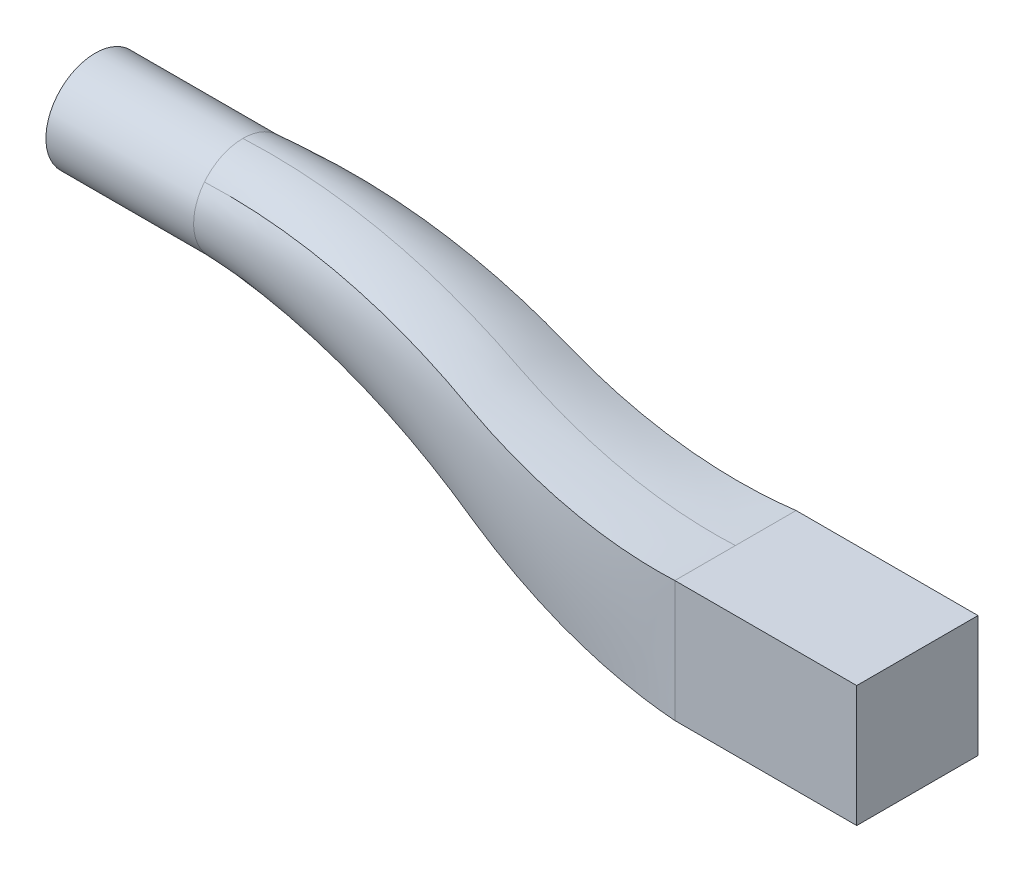
ISO-10303-21;
HEADER;
FILE_DESCRIPTION(('STEP AP214'),'2;1');
FILE_NAME('part.step','',(''),(''),'','','');
FILE_SCHEMA(('AUTOMOTIVE_DESIGN { 1 0 10303 214 1 1 1 1 }'));
ENDSEC;
DATA;
#1=APPLICATION_CONTEXT('core data for automotive mechanical design processes');
#2=APPLICATION_PROTOCOL_DEFINITION('international standard','automotive_design',2000,#1);
#3=PRODUCT_CONTEXT('',#1,'mechanical');
#4=PRODUCT('Part','Part','',(#3));
#5=PRODUCT_RELATED_PRODUCT_CATEGORY('part','',(#4));
#6=PRODUCT_DEFINITION_FORMATION('','',#4);
#7=PRODUCT_DEFINITION_CONTEXT('part definition',#1,'design');
#8=PRODUCT_DEFINITION('design','',#6,#7);
#9=PRODUCT_DEFINITION_SHAPE('','',#8);
#10=(LENGTH_UNIT() NAMED_UNIT(*) SI_UNIT(.MILLI.,.METRE.));
#11=(NAMED_UNIT(*) PLANE_ANGLE_UNIT() SI_UNIT($,.RADIAN.));
#12=(NAMED_UNIT(*) SI_UNIT($,.STERADIAN.) SOLID_ANGLE_UNIT());
#13=UNCERTAINTY_MEASURE_WITH_UNIT(LENGTH_MEASURE(1.E-05),#10,'distance_accuracy_value','');
#14=(GEOMETRIC_REPRESENTATION_CONTEXT(3) GLOBAL_UNCERTAINTY_ASSIGNED_CONTEXT((#13)) GLOBAL_UNIT_ASSIGNED_CONTEXT((#10,
#11,#12)) REPRESENTATION_CONTEXT('',''));
#15=CARTESIAN_POINT('',(0.,0.,0.));
#16=DIRECTION('',(0.,0.,1.));
#17=DIRECTION('',(1.,0.,0.));
#18=AXIS2_PLACEMENT_3D('',#15,#16,#17);
#19=CARTESIAN_POINT('',(0.,63.7863619156872,-79.7329523946089));
#20=CARTESIAN_POINT('',(196.914895518404,80.6131064873941,-88.2644294514036));
#21=CARTESIAN_POINT('',(392.936444227266,45.4312189083686,-96.7959065081982));
#22=CARTESIAN_POINT('',(708.143629326014,-103.611491656139,-112.128255709995));
#23=CARTESIAN_POINT('',(864.402326566791,-131.656754821237,-118.929127854998));
#24=CARTESIAN_POINT('',(1021.37315576226,-118.243305111773,-125.73));
#25=CARTESIAN_POINT('',(0.,69.4779385507464,-75.1796910865616));
#26=CARTESIAN_POINT('',(196.914895518404,85.2490163349766,-82.5147106967684));
#27=CARTESIAN_POINT('',(392.936444227266,49.0114619684744,-89.8497303069752));
#28=CARTESIAN_POINT('',(708.143629326014,-101.92844080772,-103.0318652781));
#29=CARTESIAN_POINT('',(864.402326566791,-130.815229397028,-108.878980639018));
#30=CARTESIAN_POINT('',(1021.37315576226,-118.243305111773,-114.726095999935));
#31=CARTESIAN_POINT('',(0.,80.1263231421359,-64.6489366794776));
#32=CARTESIAN_POINT('',(196.914895518404,93.9223513620389,-69.961228540226));
#33=CARTESIAN_POINT('',(392.936444227266,55.7097474312095,-75.2735204009744));
#34=CARTESIAN_POINT('',(708.143629326014,-98.7796168754476,-84.8205089621158));
#35=CARTESIAN_POINT('',(864.402326566791,-129.240817430892,-89.0552056625087));
#36=CARTESIAN_POINT('',(1021.37315576226,-118.243305111772,-93.2899023629017));
#37=CARTESIAN_POINT('',(0.,90.4960369406616,-48.3933185319076));
#38=CARTESIAN_POINT('',(196.914895518404,102.368703119665,-51.8943146244922));
#39=CARTESIAN_POINT('',(392.936444227267,62.2327371479364,-55.3953107170768));
#40=CARTESIAN_POINT('',(708.143629326014,-95.713198424896,-61.6871279825153));
#41=CARTESIAN_POINT('',(864.402326566792,-127.707608205616,-64.4779491553693));
#42=CARTESIAN_POINT('',(1021.37315576226,-118.243305111773,-67.2687703282233));
#43=CARTESIAN_POINT('',(0.,96.4786554645608,-34.0989326196559));
#44=CARTESIAN_POINT('',(196.914895518404,107.24167275666,-36.4222042994631));
#45=CARTESIAN_POINT('',(392.936444227267,65.9960578980273,-38.7454759792703));
#46=CARTESIAN_POINT('',(708.143629326014,-93.9440838494383,-42.920745097187));
#47=CARTESIAN_POINT('',(864.402326566791,-126.823050917887,-44.7727425352964));
#48=CARTESIAN_POINT('',(1021.37315576226,-118.243305111773,-46.6247399734059));
#49=CARTESIAN_POINT('',(0.,99.7287540430284,-22.9225454122928));
#50=CARTESIAN_POINT('',(196.914895518404,109.888946960564,-24.4508345638146));
#51=CARTESIAN_POINT('',(392.936444227266,68.0405077273667,-25.9791237153363));
#52=CARTESIAN_POINT('',(708.143629326014,-92.9830002129214,-28.7256894971417));
#53=CARTESIAN_POINT('',(864.402326566791,-126.342509099629,-29.9439661274252));
#54=CARTESIAN_POINT('',(1021.37315576226,-118.243305111773,-31.1622427577088));
#55=CARTESIAN_POINT('',(0.,101.679670600912,-11.4807903492074));
#56=CARTESIAN_POINT('',(196.914895518404,111.478009862184,-12.2548988430634));
#57=CARTESIAN_POINT('',(392.936444227267,69.2677169727244,-13.0290073369195));
#58=CARTESIAN_POINT('',(708.143629326014,-92.406096486858,-14.4201968893107));
#59=CARTESIAN_POINT('',(864.402326566791,-126.054057236597,-15.0372779478459));
#60=CARTESIAN_POINT('',(1021.37315576226,-118.243305111773,-15.6543590063811));
#61=CARTESIAN_POINT('',(0.,102.108,-3.81226759974523));
#62=CARTESIAN_POINT('',(196.914895518404,111.826893239597,-4.07684983932942));
#63=CARTESIAN_POINT('',(392.936444227266,69.5371543284615,-4.3414320789136));
#64=CARTESIAN_POINT('',(708.143629326014,-92.2794355974838,-4.81692621233186));
#65=CARTESIAN_POINT('',(864.402326566791,-125.99072679191,-5.02783810616592));
#66=CARTESIAN_POINT('',(1021.37315576226,-118.243305111773,-5.23874999999999));
#67=CARTESIAN_POINT('',(0.,102.108,0.));
#68=CARTESIAN_POINT('',(196.914895518404,111.826893239597,0.));
#69=CARTESIAN_POINT('',(392.936444227266,69.5371543284615,0.));
#70=CARTESIAN_POINT('',(708.143629326014,-92.2794355974838,0.));
#71=CARTESIAN_POINT('',(864.402326566791,-125.99072679191,0.));
#72=CARTESIAN_POINT('',(1021.37315576226,-118.243305111773,0.));
#73=B_SPLINE_SURFACE_WITH_KNOTS('',3,3,((#19,#20,#21,#22,#23,#24),(#25,#26,#27,#28,#29,#30),
(#31,#32,#33,#34,#35,#36),(#37,#38,#39,#40,#41,#42),(#43,#44,#45,#46,#47,#48),(#49,#50,#51,#52,
#53,#54),(#55,#56,#57,#58,#59,#60),(#61,#62,#63,#64,#65,#66),(#67,#68,#69,#70,#71,#72)),
.UNSPECIFIED.,.F.,.F.,.F.,(4,1,1,1,1,1,4),(4,2,4),(0.866194178130681,0.899645633598011,
0.933097089065341,0.949822816799005,0.96654854453267,0.983274272266335,1.),(0.,
0.556436391090984,1.),.UNSPECIFIED.);
#74=CARTESIAN_POINT('',(0.,0.,0.));
#75=DIRECTION('',(1.,0.,0.));
#76=DIRECTION('',(0.,0.,-1.));
#77=AXIS2_PLACEMENT_3D('',#74,#75,#76);
#78=CIRCLE('',#77,102.108);
#79=CARTESIAN_POINT('',(0.,63.7867207358618,-79.7334010755966));
#80=VERTEX_POINT('',#79);
#81=CARTESIAN_POINT('',(0.,102.108,0.));
#82=VERTEX_POINT('',#81);
#83=EDGE_CURVE('E192',#80,#82,#78,.T.);
#84=CARTESIAN_POINT('',(0.,102.108,0.));
#85=CARTESIAN_POINT('',(196.914895518404,111.826893239597,0.));
#86=CARTESIAN_POINT('',(392.936444227266,69.5371543284615,0.));
#87=CARTESIAN_POINT('',(708.143629326014,-92.2794355974838,0.));
#88=CARTESIAN_POINT('',(864.402326566791,-125.99072679191,0.));
#89=CARTESIAN_POINT('',(1021.37315576226,-118.243305111773,0.));
#90=B_SPLINE_CURVE_WITH_KNOTS('',3,(#84,#85,#86,#87,#88,#89),.UNSPECIFIED.,.F.,.F.,(4,2,4),(0.,
0.556436391090984,1.),.UNSPECIFIED.);
#91=CARTESIAN_POINT('',(1021.37315576226,-118.243305111773,0.));
#92=VERTEX_POINT('',#91);
#93=EDGE_CURVE('E219',#82,#92,#90,.T.);
#94=DIRECTION('',(0.,0.,1.));
#95=VECTOR('',#94,1.);
#96=CARTESIAN_POINT('',(1021.37315576226,-118.243305111773,-125.73));
#97=LINE('',#96,#95);
#98=CARTESIAN_POINT('',(1021.37315576226,-118.243305111773,-125.73));
#99=VERTEX_POINT('',#98);
#100=EDGE_CURVE('E13',#99,#92,#97,.T.);
#101=CARTESIAN_POINT('',(0.,63.7863619156872,-79.7329523946089));
#102=CARTESIAN_POINT('',(196.914895518404,80.6131064873941,-88.2644294514036));
#103=CARTESIAN_POINT('',(392.936444227266,45.4312189083686,-96.7959065081982));
#104=CARTESIAN_POINT('',(708.143629326014,-103.611491656139,-112.128255709995));
#105=CARTESIAN_POINT('',(864.402326566791,-131.656754821237,-118.929127854998));
#106=CARTESIAN_POINT('',(1021.37315576226,-118.243305111773,-125.73));
#107=B_SPLINE_CURVE_WITH_KNOTS('',3,(#101,#102,#103,#104,#105,#106),.UNSPECIFIED.,.F.,.F.,(4,2,
4),(0.,0.556436391090984,1.),.UNSPECIFIED.);
#108=EDGE_CURVE('E155',#80,#99,#107,.T.);
#109=ORIENTED_EDGE('',*,*,#83,.T.);
#110=ORIENTED_EDGE('',*,*,#93,.T.);
#111=ORIENTED_EDGE('',*,*,#100,.F.);
#112=ORIENTED_EDGE('',*,*,#108,.F.);
#113=EDGE_LOOP('',(#109,#110,#111,#112));
#114=FACE_BOUND('',#113,.T.);
#115=ADVANCED_FACE('F127',(#114),#73,.T.);
#116=CARTESIAN_POINT('',(0.,-78.4415384171289,-65.3679486809407));
#117=CARTESIAN_POINT('',(196.914895518404,-81.8750322887881,-76.5638293458827));
#118=CARTESIAN_POINT('',(392.936444227266,-137.31715831118,-87.7597100108248));
#119=CARTESIAN_POINT('',(708.143629326014,-322.770568764749,-107.880393783845));
#120=CARTESIAN_POINT('',(864.402326566791,-366.966293375542,-116.805196891922));
#121=CARTESIAN_POINT('',(1021.37315576226,-369.703305111773,-125.73));
#122=CARTESIAN_POINT('',(0.,-74.2176822369396,-70.4365760971677));
#123=CARTESIAN_POINT('',(196.914895518404,-76.4912577758443,-80.6923338463531));
#124=CARTESIAN_POINT('',(392.936444227266,-130.773465465481,-90.9480915955384));
#125=CARTESIAN_POINT('',(708.143629326014,-314.142327979113,-109.379232896482));
#126=CARTESIAN_POINT('',(864.402326566791,-357.413422982725,-117.554616448241));
#127=CARTESIAN_POINT('',(1021.37315576226,-359.225805111773,-125.73));
#128=CARTESIAN_POINT('',(0.,-64.7847113542134,-79.7525874017345));
#129=CARTESIAN_POINT('',(196.914895518404,-64.9211947930977,-88.2804225810278));
#130=CARTESIAN_POINT('',(392.936444227266,-117.066310382714,-96.8082577603212));
#131=CARTESIAN_POINT('',(708.143629326014,-296.594496523922,-112.134061959743));
#132=CARTESIAN_POINT('',(864.402326566791,-338.162007255129,-118.932030979872));
#133=CARTESIAN_POINT('',(1021.37315576226,-338.270805111772,-125.73));
#134=CARTESIAN_POINT('',(0.,-48.2077073794319,-90.7386603327389));
#135=CARTESIAN_POINT('',(196.914895518404,-45.5888112862697,-97.2288119207021));
#136=CARTESIAN_POINT('',(392.936444227266,-94.9785473438401,-103.718963508665));
#137=CARTESIAN_POINT('',(708.143629326014,-269.554901476641,-115.382743397752));
#138=CARTESIAN_POINT('',(864.402326566791,-308.925959731488,-120.556371698876));
#139=CARTESIAN_POINT('',(1021.37315576226,-306.838305111772,-125.73));
#140=CARTESIAN_POINT('',(0.,-29.8251363963501,-98.3258417527659));
#141=CARTESIAN_POINT('',(196.914895518404,-24.7857551677988,-103.408732058092));
#142=CARTESIAN_POINT('',(392.936444227267,-71.75500608998,-108.491622363417));
#143=CARTESIAN_POINT('',(708.143629326014,-241.981383883809,-117.626341779162));
#144=CARTESIAN_POINT('',(864.402326566791,-279.422950935072,-121.678170889581));
#145=CARTESIAN_POINT('',(1021.37315576226,-275.405805111773,-125.73));
#146=CARTESIAN_POINT('',(0.,-10.3251775795025,-102.229582182344));
#147=CARTESIAN_POINT('',(196.914895518404,-3.07256296678534,-106.588411408873));
#148=CARTESIAN_POINT('',(392.936444227267,-47.8285805048006,-110.947240635402));
#149=CARTESIAN_POINT('',(708.143629326014,-214.077444570912,-118.780713241287));
#150=CARTESIAN_POINT('',(864.402326566792,-249.754731278624,-122.255356620643));
#151=CARTESIAN_POINT('',(1021.37315576226,-243.973305111773,-125.73));
#152=CARTESIAN_POINT('',(0.,9.56155319842292,-102.303893463957));
#153=CARTESIAN_POINT('',(196.914895518404,18.9556631972403,-106.648939523367));
#154=CARTESIAN_POINT('',(392.936444227266,-23.6588589546748,-110.993985582776));
#155=CARTESIAN_POINT('',(708.143629326014,-186.059133280094,-118.802687761457));
#156=CARTESIAN_POINT('',(864.402326566791,-220.029325633215,-122.266343880729));
#157=CARTESIAN_POINT('',(1021.37315576226,-212.540805111773,-125.73));
#158=CARTESIAN_POINT('',(0.,29.09000374623,-98.5457214282046));
#159=CARTESIAN_POINT('',(196.914895518404,40.6920625172297,-103.587828715839));
#160=CARTESIAN_POINT('',(392.936444227266,0.285489137496903,-108.629936003473));
#161=CARTESIAN_POINT('',(708.143629326013,-158.146768703858,-117.691362194071));
#162=CARTESIAN_POINT('',(864.402326566791,-190.356893345097,-121.710681097036));
#163=CARTESIAN_POINT('',(1021.37315576226,-181.108305111772,-125.73));
#164=CARTESIAN_POINT('',(0.,47.5289947982125,-91.096260494005));
#165=CARTESIAN_POINT('',(196.914895518404,61.5410739780932,-97.5200848342387));
#166=CARTESIAN_POINT('',(392.936444227266,23.5445210072415,-103.943909174472));
#167=CARTESIAN_POINT('',(708.143629326013,-130.556567184774,-115.488489009804));
#168=CARTESIAN_POINT('',(864.402326566791,-160.845542585555,-120.609244504902));
#169=CARTESIAN_POINT('',(1021.37315576226,-149.675805111772,-125.73));
#170=CARTESIAN_POINT('',(0.,58.634287687681,-83.8546117770138));
#171=CARTESIAN_POINT('',(196.914895518404,74.4732786935242,-91.6216084097912));
#172=CARTESIAN_POINT('',(392.936444227266,38.303637548635,-99.3886050425687));
#173=CARTESIAN_POINT('',(708.143629326014,-112.514214939871,-113.347067783564));
#174=CARTESIAN_POINT('',(864.402326566791,-141.346866463103,-119.538533891782));
#175=CARTESIAN_POINT('',(1021.37315576226,-128.720805111773,-125.73));
#176=CARTESIAN_POINT('',(0.,63.7863619156872,-79.7329523946089));
#177=CARTESIAN_POINT('',(196.914895518404,80.6131064873941,-88.2644294514036));
#178=CARTESIAN_POINT('',(392.936444227266,45.4312189083686,-96.7959065081982));
#179=CARTESIAN_POINT('',(708.143629326014,-103.611491656139,-112.128255709995));
#180=CARTESIAN_POINT('',(864.402326566791,-131.656754821237,-118.929127854998));
#181=CARTESIAN_POINT('',(1021.37315576226,-118.243305111773,-125.73));
#182=B_SPLINE_SURFACE_WITH_KNOTS('',3,3,((#116,#117,#118,#119,#120,#121),(#122,#123,#124,#125,
#126,#127),(#128,#129,#130,#131,#132,#133),(#134,#135,#136,#137,#138,#139),(#140,#141,#142,#143,
#144,#145),(#146,#147,#148,#149,#150,#151),(#152,#153,#154,#155,#156,#157),(#158,#159,#160,#161,
#162,#163),(#164,#165,#166,#167,#168,#169),(#170,#171,#172,#173,#174,#175),(#176,#177,#178,#179,
#180,#181)),.UNSPECIFIED.,.F.,.F.,.F.,(4,1,1,1,1,1,1,1,4),(4,2,4),(0.617785515405924,
0.648836598246518,0.679887681087113,0.710938763927708,0.741989846768302,0.773040929608897,
0.804092012449491,0.835143095290086,0.866194178130681),(0.,0.556436391090984,1.),.UNSPECIFIED.);
#183=CARTESIAN_POINT('',(0.,-78.4419888320104,-65.368324117985));
#184=VERTEX_POINT('',#183);
#185=EDGE_CURVE('E195',#184,#80,#78,.T.);
#186=DIRECTION('',(0.,1.,0.));
#187=VECTOR('',#186,1.);
#188=CARTESIAN_POINT('',(1021.37315576226,-118.243305111773,-125.73));
#189=LINE('',#188,#187);
#190=CARTESIAN_POINT('',(1021.37315576226,-369.703305111773,-125.73));
#191=VERTEX_POINT('',#190);
#192=EDGE_CURVE('E340',#191,#99,#189,.T.);
#193=CARTESIAN_POINT('',(0.,-78.4415384171289,-65.3679486809407));
#194=CARTESIAN_POINT('',(196.914895518404,-81.8750322887881,-76.5638293458827));
#195=CARTESIAN_POINT('',(392.936444227266,-137.31715831118,-87.7597100108248));
#196=CARTESIAN_POINT('',(708.143629326014,-322.770568764749,-107.880393783845));
#197=CARTESIAN_POINT('',(864.402326566791,-366.966293375542,-116.805196891922));
#198=CARTESIAN_POINT('',(1021.37315576226,-369.703305111773,-125.73));
#199=B_SPLINE_CURVE_WITH_KNOTS('',3,(#193,#194,#195,#196,#197,#198),.UNSPECIFIED.,.F.,.F.,(4,2,
4),(0.,0.556436391090984,1.),.UNSPECIFIED.);
#200=EDGE_CURVE('E211',#184,#191,#199,.T.);
#201=ORIENTED_EDGE('',*,*,#185,.T.);
#202=ORIENTED_EDGE('',*,*,#108,.T.);
#203=ORIENTED_EDGE('',*,*,#192,.F.);
#204=ORIENTED_EDGE('',*,*,#200,.F.);
#205=EDGE_LOOP('',(#201,#202,#203,#204));
#206=FACE_BOUND('',#205,.T.);
#207=ADVANCED_FACE('F209',(#206),#182,.T.);
#208=CARTESIAN_POINT('',(0.,-78.4415384171288,65.3679486809408));
#209=CARTESIAN_POINT('',(196.914895518404,-81.8750322887881,76.5638293458828));
#210=CARTESIAN_POINT('',(392.936444227266,-137.31715831118,87.7597100108248));
#211=CARTESIAN_POINT('',(708.143629326014,-322.770568764749,107.880393783845));
#212=CARTESIAN_POINT('',(864.402326566791,-366.966293375542,116.805196891922));
#213=CARTESIAN_POINT('',(1021.37315576226,-369.703305111773,125.73));
#214=CARTESIAN_POINT('',(0.,-82.2260063866525,60.8265871175123));
#215=CARTESIAN_POINT('',(196.914895518404,-84.9575616919247,70.9214399662336));
#216=CARTESIAN_POINT('',(392.936444227266,-139.697749147929,81.0162928149548));
#217=CARTESIAN_POINT('',(708.143629326014,-323.889670278324,99.158263775784));
#218=CARTESIAN_POINT('',(864.402326566791,-367.52584413233,107.205381887892));
#219=CARTESIAN_POINT('',(1021.37315576226,-369.703305111773,115.2525));
#220=CARTESIAN_POINT('',(0.,-89.0043177012509,51.085121977123));
#221=CARTESIAN_POINT('',(196.914895518404,-90.4786399779944,59.1001018696261));
#222=CARTESIAN_POINT('',(392.936444227266,-143.96159440547,67.1150817621291));
#223=CARTESIAN_POINT('',(708.143629326014,-325.894078430998,81.5192077697547));
#224=CARTESIAN_POINT('',(864.402326566791,-368.528048208667,87.9083538848773));
#225=CARTESIAN_POINT('',(1021.37315576226,-369.703305111773,94.2975));
#226=CARTESIAN_POINT('',(0.,-96.4932572646999,34.9353565808209));
#227=CARTESIAN_POINT('',(196.914895518404,-96.578540040182,40.1157132436962));
#228=CARTESIAN_POINT('',(392.936444227266,-148.672454966396,45.2960699065716));
#229=CARTESIAN_POINT('',(708.143629326013,-328.108625804108,54.605951046298));
#230=CARTESIAN_POINT('',(864.402326566791,-369.635321895222,58.7354755231489));
#231=CARTESIAN_POINT('',(1021.37315576226,-369.703305111773,62.865));
#232=CARTESIAN_POINT('',(0.,-101.078827103031,17.7345338404044));
#233=CARTESIAN_POINT('',(196.914895518404,-100.313583901201,20.2752161254483));
#234=CARTESIAN_POINT('',(392.936444227267,-151.556972850103,22.8158984104922));
#235=CARTESIAN_POINT('',(708.143629326014,-329.464620408372,27.3818871303574));
#236=CARTESIAN_POINT('',(864.402326566792,-370.313319197354,29.4071935651787));
#237=CARTESIAN_POINT('',(1021.37315576226,-369.703305111773,31.4324999999999));
#238=CARTESIAN_POINT('',(0.,-102.622773632911,1.05818132034585E-13));
#239=CARTESIAN_POINT('',(196.914895518404,-101.57116108604,0.));
#240=CARTESIAN_POINT('',(392.936444227267,-152.528180689901,0.));
#241=CARTESIAN_POINT('',(708.143629326014,-329.921179404876,0.));
#242=CARTESIAN_POINT('',(864.402326566792,-370.541598695606,0.));
#243=CARTESIAN_POINT('',(1021.37315576226,-369.703305111773,0.));
#244=CARTESIAN_POINT('',(0.,-101.078827103031,-17.7345338404043));
#245=CARTESIAN_POINT('',(196.914895518404,-100.313583901201,-20.2752161254482));
#246=CARTESIAN_POINT('',(392.936444227266,-151.556972850103,-22.8158984104922));
#247=CARTESIAN_POINT('',(708.143629326014,-329.464620408372,-27.3818871303575));
#248=CARTESIAN_POINT('',(864.402326566791,-370.313319197354,-29.4071935651788));
#249=CARTESIAN_POINT('',(1021.37315576226,-369.703305111773,-31.4325000000001));
#250=CARTESIAN_POINT('',(0.,-96.4932572647,-34.9353565808207));
#251=CARTESIAN_POINT('',(196.914895518404,-96.5785400401821,-40.1157132436961));
#252=CARTESIAN_POINT('',(392.936444227266,-148.672454966397,-45.2960699065716));
#253=CARTESIAN_POINT('',(708.143629326013,-328.108625804108,-54.605951046298));
#254=CARTESIAN_POINT('',(864.402326566791,-369.635321895222,-58.7354755231491));
#255=CARTESIAN_POINT('',(1021.37315576226,-369.703305111773,-62.8650000000002));
#256=CARTESIAN_POINT('',(0.,-89.004317701251,-51.0851219771228));
#257=CARTESIAN_POINT('',(196.914895518404,-90.4786399779944,-59.1001018696259));
#258=CARTESIAN_POINT('',(392.936444227266,-143.96159440547,-67.115081762129));
#259=CARTESIAN_POINT('',(708.143629326013,-325.894078430999,-81.5192077697547));
#260=CARTESIAN_POINT('',(864.402326566791,-368.528048208667,-87.9083538848774));
#261=CARTESIAN_POINT('',(1021.37315576226,-369.703305111773,-94.2975000000001));
#262=CARTESIAN_POINT('',(0.,-82.2260063866526,-60.8265871175122));
#263=CARTESIAN_POINT('',(196.914895518404,-84.9575616919248,-70.9214399662335));
#264=CARTESIAN_POINT('',(392.936444227266,-139.697749147929,-81.0162928149548));
#265=CARTESIAN_POINT('',(708.143629326014,-323.889670278324,-99.1582637757841));
#266=CARTESIAN_POINT('',(864.402326566791,-367.52584413233,-107.205381887892));
#267=CARTESIAN_POINT('',(1021.37315576226,-369.703305111773,-115.2525));
#268=CARTESIAN_POINT('',(0.,-78.4415384171289,-65.3679486809407));
#269=CARTESIAN_POINT('',(196.914895518404,-81.8750322887881,-76.5638293458827));
#270=CARTESIAN_POINT('',(392.936444227266,-137.31715831118,-87.7597100108248));
#271=CARTESIAN_POINT('',(708.143629326014,-322.770568764749,-107.880393783845));
#272=CARTESIAN_POINT('',(864.402326566791,-366.966293375542,-116.805196891922));
#273=CARTESIAN_POINT('',(1021.37315576226,-369.703305111773,-125.73));
#274=B_SPLINE_SURFACE_WITH_KNOTS('',3,3,((#208,#209,#210,#211,#212,#213),(#214,#215,#216,#217,
#218,#219),(#220,#221,#222,#223,#224,#225),(#226,#227,#228,#229,#230,#231),(#232,#233,#234,#235,
#236,#237),(#238,#239,#240,#241,#242,#243),(#244,#245,#246,#247,#248,#249),(#250,#251,#252,#253,
#254,#255),(#256,#257,#258,#259,#260,#261),(#262,#263,#264,#265,#266,#267),(#268,#269,#270,#271,
#272,#273)),.UNSPECIFIED.,.F.,.F.,.F.,(4,1,1,1,1,1,1,1,4),(4,2,4),(0.382214484594076,
0.411660863445557,0.441107242297038,0.470553621148519,0.5,0.529446378851481,0.558892757702962,
0.588339136554443,0.617785515405924),(0.,0.556436391090984,1.),.UNSPECIFIED.);
#275=CARTESIAN_POINT('',(0.,-78.4419910130432,65.3683259191914));
#276=VERTEX_POINT('',#275);
#277=EDGE_CURVE('E212',#276,#184,#78,.T.);
#278=DIRECTION('',(0.,0.,-1.));
#279=VECTOR('',#278,1.);
#280=CARTESIAN_POINT('',(1021.37315576226,-369.703305111773,-125.73));
#281=LINE('',#280,#279);
#282=CARTESIAN_POINT('',(1021.37315576226,-369.703305111773,125.73));
#283=VERTEX_POINT('',#282);
#284=EDGE_CURVE('E324',#283,#191,#281,.T.);
#285=CARTESIAN_POINT('',(0.,-78.4415384171288,65.3679486809408));
#286=CARTESIAN_POINT('',(196.914895518404,-81.8750322887881,76.5638293458828));
#287=CARTESIAN_POINT('',(392.936444227266,-137.31715831118,87.7597100108248));
#288=CARTESIAN_POINT('',(708.143629326014,-322.770568764749,107.880393783845));
#289=CARTESIAN_POINT('',(864.402326566791,-366.966293375542,116.805196891922));
#290=CARTESIAN_POINT('',(1021.37315576226,-369.703305111773,125.73));
#291=B_SPLINE_CURVE_WITH_KNOTS('',3,(#285,#286,#287,#288,#289,#290),.UNSPECIFIED.,.F.,.F.,(4,2,
4),(0.,0.556436391090984,1.),.UNSPECIFIED.);
#292=EDGE_CURVE('E223',#276,#283,#291,.T.);
#293=ORIENTED_EDGE('',*,*,#277,.T.);
#294=ORIENTED_EDGE('',*,*,#200,.T.);
#295=ORIENTED_EDGE('',*,*,#284,.F.);
#296=ORIENTED_EDGE('',*,*,#292,.F.);
#297=EDGE_LOOP('',(#293,#294,#295,#296));
#298=FACE_BOUND('',#297,.T.);
#299=ADVANCED_FACE('F275',(#298),#274,.T.);
#300=CARTESIAN_POINT('',(0.,63.7863619156872,79.7329523946089));
#301=CARTESIAN_POINT('',(196.914895518404,80.6131064873941,88.2644294514036));
#302=CARTESIAN_POINT('',(392.936444227266,45.4312189083686,96.7959065081982));
#303=CARTESIAN_POINT('',(708.143629326014,-103.611491656139,112.128255709995));
#304=CARTESIAN_POINT('',(864.402326566791,-131.656754821237,118.929127854998));
#305=CARTESIAN_POINT('',(1021.37315576226,-118.243305111773,125.73));
#306=CARTESIAN_POINT('',(0.,58.634287687681,83.8546117770138));
#307=CARTESIAN_POINT('',(196.914895518404,74.4732786935242,91.6216084097913));
#308=CARTESIAN_POINT('',(392.936444227266,38.303637548635,99.3886050425687));
#309=CARTESIAN_POINT('',(708.143629326014,-112.514214939871,113.347067783564));
#310=CARTESIAN_POINT('',(864.402326566791,-141.346866463103,119.538533891782));
#311=CARTESIAN_POINT('',(1021.37315576226,-128.720805111773,125.73));
#312=CARTESIAN_POINT('',(0.,47.5289947982124,91.0962604940046));
#313=CARTESIAN_POINT('',(196.914895518404,61.5410739780931,97.5200848342384));
#314=CARTESIAN_POINT('',(392.936444227267,23.5445210072414,103.943909174472));
#315=CARTESIAN_POINT('',(708.143629326014,-130.556567184775,115.488489009804));
#316=CARTESIAN_POINT('',(864.402326566791,-160.845542585555,120.609244504902));
#317=CARTESIAN_POINT('',(1021.37315576226,-149.675805111773,125.73));
#318=CARTESIAN_POINT('',(0.,29.0900037462301,98.5457214282054));
#319=CARTESIAN_POINT('',(196.914895518404,40.6920625172297,103.587828715839));
#320=CARTESIAN_POINT('',(392.936444227267,0.285489137496868,108.629936003473));
#321=CARTESIAN_POINT('',(708.143629326014,-158.146768703858,117.691362194071));
#322=CARTESIAN_POINT('',(864.402326566792,-190.356893345097,121.710681097036));
#323=CARTESIAN_POINT('',(1021.37315576226,-181.108305111773,125.73));
#324=CARTESIAN_POINT('',(0.,9.56155319842298,102.303893463956));
#325=CARTESIAN_POINT('',(196.914895518404,18.9556631972403,106.648939523366));
#326=CARTESIAN_POINT('',(392.936444227266,-23.6588589546747,110.993985582776));
#327=CARTESIAN_POINT('',(708.143629326014,-186.059133280094,118.802687761457));
#328=CARTESIAN_POINT('',(864.402326566791,-220.029325633215,122.266343880728));
#329=CARTESIAN_POINT('',(1021.37315576226,-212.540805111773,125.73));
#330=CARTESIAN_POINT('',(0.,-10.3251775795025,102.229582182344));
#331=CARTESIAN_POINT('',(196.914895518404,-3.07256296678528,106.588411408873));
#332=CARTESIAN_POINT('',(392.936444227266,-47.8285805048005,110.947240635402));
#333=CARTESIAN_POINT('',(708.143629326013,-214.077444570912,118.780713241287));
#334=CARTESIAN_POINT('',(864.402326566791,-249.754731278624,122.255356620644));
#335=CARTESIAN_POINT('',(1021.37315576226,-243.973305111772,125.73));
#336=CARTESIAN_POINT('',(0.,-29.8251363963499,98.3258417527657));
#337=CARTESIAN_POINT('',(196.914895518404,-24.7857551677987,103.408732058091));
#338=CARTESIAN_POINT('',(392.936444227266,-71.7550060899799,108.491622363417));
#339=CARTESIAN_POINT('',(708.143629326014,-241.981383883809,117.626341779162));
#340=CARTESIAN_POINT('',(864.402326566791,-279.422950935072,121.678170889581));
#341=CARTESIAN_POINT('',(1021.37315576226,-275.405805111773,125.73));
#342=CARTESIAN_POINT('',(0.,-48.2077073794319,90.7386603327391));
#343=CARTESIAN_POINT('',(196.914895518404,-45.5888112862698,97.2288119207023));
#344=CARTESIAN_POINT('',(392.936444227267,-94.9785473438402,103.718963508665));
#345=CARTESIAN_POINT('',(708.143629326014,-269.554901476642,115.382743397752));
#346=CARTESIAN_POINT('',(864.402326566791,-308.925959731489,120.556371698876));
#347=CARTESIAN_POINT('',(1021.37315576226,-306.838305111773,125.73));
#348=CARTESIAN_POINT('',(0.,-64.7847113542132,79.7525874017345));
#349=CARTESIAN_POINT('',(196.914895518404,-64.9211947930975,88.2804225810279));
#350=CARTESIAN_POINT('',(392.936444227266,-117.066310382714,96.8082577603212));
#351=CARTESIAN_POINT('',(708.143629326014,-296.594496523922,112.134061959743));
#352=CARTESIAN_POINT('',(864.402326566791,-338.162007255129,118.932030979871));
#353=CARTESIAN_POINT('',(1021.37315576226,-338.270805111773,125.73));
#354=CARTESIAN_POINT('',(0.,-74.2176822369396,70.4365760971678));
#355=CARTESIAN_POINT('',(196.914895518404,-76.4912577758442,80.6923338463531));
#356=CARTESIAN_POINT('',(392.936444227266,-130.773465465481,90.9480915955384));
#357=CARTESIAN_POINT('',(708.143629326014,-314.142327979113,109.379232896482));
#358=CARTESIAN_POINT('',(864.402326566791,-357.413422982725,117.554616448241));
#359=CARTESIAN_POINT('',(1021.37315576226,-359.225805111773,125.73));
#360=CARTESIAN_POINT('',(0.,-78.4415384171288,65.3679486809408));
#361=CARTESIAN_POINT('',(196.914895518404,-81.8750322887881,76.5638293458828));
#362=CARTESIAN_POINT('',(392.936444227266,-137.31715831118,87.7597100108248));
#363=CARTESIAN_POINT('',(708.143629326014,-322.770568764749,107.880393783845));
#364=CARTESIAN_POINT('',(864.402326566791,-366.966293375542,116.805196891922));
#365=CARTESIAN_POINT('',(1021.37315576226,-369.703305111773,125.73));
#366=B_SPLINE_SURFACE_WITH_KNOTS('',3,3,((#300,#301,#302,#303,#304,#305),(#306,#307,#308,#309,
#310,#311),(#312,#313,#314,#315,#316,#317),(#318,#319,#320,#321,#322,#323),(#324,#325,#326,#327,
#328,#329),(#330,#331,#332,#333,#334,#335),(#336,#337,#338,#339,#340,#341),(#342,#343,#344,#345,
#346,#347),(#348,#349,#350,#351,#352,#353),(#354,#355,#356,#357,#358,#359),(#360,#361,#362,#363,
#364,#365)),.UNSPECIFIED.,.F.,.F.,.F.,(4,1,1,1,1,1,1,1,4),(4,2,4),(0.133805821869319,
0.164856904709914,0.195907987550508,0.226959070391103,0.258010153231698,0.289061236072292,
0.320112318912887,0.351163401753481,0.382214484594076),(0.,0.556436391090984,1.),.UNSPECIFIED.);
#367=CARTESIAN_POINT('',(0.,63.7867199650181,79.7334001299471));
#368=VERTEX_POINT('',#367);
#369=EDGE_CURVE('E133',#368,#276,#78,.T.);
#370=DIRECTION('',(0.,-1.,0.));
#371=VECTOR('',#370,1.);
#372=CARTESIAN_POINT('',(1021.37315576226,-118.243305111773,125.73));
#373=LINE('',#372,#371);
#374=CARTESIAN_POINT('',(1021.37315576226,-118.243305111773,125.73));
#375=VERTEX_POINT('',#374);
#376=EDGE_CURVE('E221',#375,#283,#373,.T.);
#377=CARTESIAN_POINT('',(0.,63.7863619156872,79.7329523946089));
#378=CARTESIAN_POINT('',(196.914895518404,80.6131064873941,88.2644294514036));
#379=CARTESIAN_POINT('',(392.936444227266,45.4312189083686,96.7959065081982));
#380=CARTESIAN_POINT('',(708.143629326014,-103.611491656139,112.128255709995));
#381=CARTESIAN_POINT('',(864.402326566791,-131.656754821237,118.929127854998));
#382=CARTESIAN_POINT('',(1021.37315576226,-118.243305111773,125.73));
#383=B_SPLINE_CURVE_WITH_KNOTS('',3,(#377,#378,#379,#380,#381,#382),.UNSPECIFIED.,.F.,.F.,(4,2,
4),(0.,0.556436391090984,1.),.UNSPECIFIED.);
#384=EDGE_CURVE('E203',#368,#375,#383,.T.);
#385=ORIENTED_EDGE('',*,*,#369,.T.);
#386=ORIENTED_EDGE('',*,*,#292,.T.);
#387=ORIENTED_EDGE('',*,*,#376,.F.);
#388=ORIENTED_EDGE('',*,*,#384,.F.);
#389=EDGE_LOOP('',(#385,#386,#387,#388));
#390=FACE_BOUND('',#389,.T.);
#391=ADVANCED_FACE('F262',(#390),#366,.T.);
#392=CARTESIAN_POINT('',(0.,102.108,0.));
#393=CARTESIAN_POINT('',(196.914895518404,111.826893239597,0.));
#394=CARTESIAN_POINT('',(392.936444227266,69.5371543284615,0.));
#395=CARTESIAN_POINT('',(708.143629326014,-92.2794355974838,0.));
#396=CARTESIAN_POINT('',(864.402326566791,-125.99072679191,0.));
#397=CARTESIAN_POINT('',(1021.37315576226,-118.243305111773,0.));
#398=CARTESIAN_POINT('',(0.,102.108,3.81226759974523));
#399=CARTESIAN_POINT('',(196.914895518404,111.826893239597,4.07684983932942));
#400=CARTESIAN_POINT('',(392.936444227266,69.5371543284615,4.34143207891361));
#401=CARTESIAN_POINT('',(708.143629326014,-92.2794355974838,4.81692621233187));
#402=CARTESIAN_POINT('',(864.402326566791,-125.99072679191,5.02783810616593));
#403=CARTESIAN_POINT('',(1021.37315576226,-118.243305111773,5.23875));
#404=CARTESIAN_POINT('',(0.,101.679670600912,11.4807903492074));
#405=CARTESIAN_POINT('',(196.914895518404,111.478009862184,12.2548988430635));
#406=CARTESIAN_POINT('',(392.936444227266,69.2677169727244,13.0290073369195));
#407=CARTESIAN_POINT('',(708.143629326014,-92.406096486858,14.4201968893107));
#408=CARTESIAN_POINT('',(864.402326566791,-126.054057236597,15.0372779478459));
#409=CARTESIAN_POINT('',(1021.37315576226,-118.243305111773,15.654359006381));
#410=CARTESIAN_POINT('',(0.,99.7287540430285,22.9225454122927));
#411=CARTESIAN_POINT('',(196.914895518404,109.888946960564,24.4508345638145));
#412=CARTESIAN_POINT('',(392.936444227266,68.0405077273667,25.9791237153363));
#413=CARTESIAN_POINT('',(708.143629326013,-92.9830002129213,28.7256894971416));
#414=CARTESIAN_POINT('',(864.402326566791,-126.342509099629,29.9439661274252));
#415=CARTESIAN_POINT('',(1021.37315576226,-118.243305111773,31.1622427577088));
#416=CARTESIAN_POINT('',(0.,96.4786554645608,34.0989326196561));
#417=CARTESIAN_POINT('',(196.914895518404,107.24167275666,36.4222042994632));
#418=CARTESIAN_POINT('',(392.936444227266,65.9960578980273,38.7454759792704));
#419=CARTESIAN_POINT('',(708.143629326014,-93.9440838494382,42.9207450971869));
#420=CARTESIAN_POINT('',(864.402326566791,-126.823050917887,44.7727425352964));
#421=CARTESIAN_POINT('',(1021.37315576226,-118.243305111773,46.6247399734058));
#422=CARTESIAN_POINT('',(0.,90.4960369406615,48.3933185319075));
#423=CARTESIAN_POINT('',(196.914895518404,102.368703119665,51.8943146244921));
#424=CARTESIAN_POINT('',(392.936444227267,62.2327371479364,55.3953107170767));
#425=CARTESIAN_POINT('',(708.143629326014,-95.713198424896,61.6871279825152));
#426=CARTESIAN_POINT('',(864.402326566792,-127.707608205616,64.4779491553692));
#427=CARTESIAN_POINT('',(1021.37315576226,-118.243305111773,67.2687703282232));
#428=CARTESIAN_POINT('',(0.,80.1263231421359,64.6489366794778));
#429=CARTESIAN_POINT('',(196.914895518404,93.9223513620389,69.9612285402262));
#430=CARTESIAN_POINT('',(392.936444227267,55.7097474312095,75.2735204009745));
#431=CARTESIAN_POINT('',(708.143629326014,-98.7796168754477,84.8205089621158));
#432=CARTESIAN_POINT('',(864.402326566792,-129.240817430892,89.0552056625088));
#433=CARTESIAN_POINT('',(1021.37315576226,-118.243305111773,93.2899023629017));
#434=CARTESIAN_POINT('',(0.,69.4779385507464,75.1796910865615));
#435=CARTESIAN_POINT('',(196.914895518404,85.2490163349766,82.5147106967684));
#436=CARTESIAN_POINT('',(392.936444227266,49.0114619684744,89.8497303069752));
#437=CARTESIAN_POINT('',(708.143629326014,-101.92844080772,103.0318652781));
#438=CARTESIAN_POINT('',(864.402326566791,-130.815229397028,108.878980639018));
#439=CARTESIAN_POINT('',(1021.37315576226,-118.243305111773,114.726095999935));
#440=CARTESIAN_POINT('',(0.,63.7863619156872,79.7329523946089));
#441=CARTESIAN_POINT('',(196.914895518404,80.6131064873941,88.2644294514036));
#442=CARTESIAN_POINT('',(392.936444227266,45.4312189083686,96.7959065081982));
#443=CARTESIAN_POINT('',(708.143629326014,-103.611491656139,112.128255709995));
#444=CARTESIAN_POINT('',(864.402326566791,-131.656754821237,118.929127854998));
#445=CARTESIAN_POINT('',(1021.37315576226,-118.243305111773,125.73));
#446=B_SPLINE_SURFACE_WITH_KNOTS('',3,3,((#392,#393,#394,#395,#396,#397),(#398,#399,#400,#401,
#402,#403),(#404,#405,#406,#407,#408,#409),(#410,#411,#412,#413,#414,#415),(#416,#417,#418,#419,
#420,#421),(#422,#423,#424,#425,#426,#427),(#428,#429,#430,#431,#432,#433),(#434,#435,#436,#437,
#438,#439),(#440,#441,#442,#443,#444,#445)),.UNSPECIFIED.,.F.,.F.,.F.,(4,1,1,1,1,1,4),(4,2,4),
(0.,0.0167257277336649,0.0334514554673298,0.0501771832009947,0.0669029109346596,
0.100354366401989,0.133805821869319),(0.,0.556436391090984,1.),.UNSPECIFIED.);
#447=EDGE_CURVE('E199',#82,#368,#78,.T.);
#448=EDGE_CURVE('E139',#92,#375,#97,.T.);
#449=ORIENTED_EDGE('',*,*,#447,.T.);
#450=ORIENTED_EDGE('',*,*,#384,.T.);
#451=ORIENTED_EDGE('',*,*,#448,.F.);
#452=ORIENTED_EDGE('',*,*,#93,.F.);
#453=EDGE_LOOP('',(#449,#450,#451,#452));
#454=FACE_BOUND('',#453,.T.);
#455=ADVANCED_FACE('F274',(#454),#446,.T.);
#456=CARTESIAN_POINT('',(1398.56315576226,-118.243305111773,125.73));
#457=DIRECTION('',(0.,0.,-1.));
#458=DIRECTION('',(-1.,0.,0.));
#459=AXIS2_PLACEMENT_3D('',#456,#457,#458);
#460=PLANE('',#459);
#461=ORIENTED_EDGE('',*,*,#376,.T.);
#462=DIRECTION('',(-1.,0.,0.));
#463=VECTOR('',#462,1.);
#464=CARTESIAN_POINT('',(1398.56315576226,-369.703305111773,125.73));
#465=LINE('',#464,#463);
#466=CARTESIAN_POINT('',(1398.56315576226,-369.703305111773,125.73));
#467=VERTEX_POINT('',#466);
#468=EDGE_CURVE('E213',#467,#283,#465,.T.);
#469=ORIENTED_EDGE('',*,*,#468,.F.);
#470=DIRECTION('',(0.,-1.,0.));
#471=VECTOR('',#470,1.);
#472=CARTESIAN_POINT('',(1398.56315576226,-118.243305111773,125.73));
#473=LINE('',#472,#471);
#474=CARTESIAN_POINT('',(1398.56315576226,-118.243305111773,125.73));
#475=VERTEX_POINT('',#474);
#476=EDGE_CURVE('E356',#475,#467,#473,.T.);
#477=ORIENTED_EDGE('',*,*,#476,.F.);
#478=DIRECTION('',(-1.,0.,0.));
#479=VECTOR('',#478,1.);
#480=CARTESIAN_POINT('',(1398.56315576226,-118.243305111773,125.73));
#481=LINE('',#480,#479);
#482=EDGE_CURVE('E335',#475,#375,#481,.T.);
#483=ORIENTED_EDGE('',*,*,#482,.T.);
#484=EDGE_LOOP('',(#461,#469,#477,#483));
#485=FACE_BOUND('',#484,.T.);
#486=ADVANCED_FACE('F352',(#485),#460,.F.);
#487=CARTESIAN_POINT('',(1398.56315576226,-369.703305111773,125.73));
#488=DIRECTION('',(0.,1.,0.));
#489=DIRECTION('',(0.,0.,1.));
#490=AXIS2_PLACEMENT_3D('',#487,#488,#489);
#491=PLANE('',#490);
#492=ORIENTED_EDGE('',*,*,#284,.T.);
#493=DIRECTION('',(-1.,0.,0.));
#494=VECTOR('',#493,1.);
#495=CARTESIAN_POINT('',(1398.56315576226,-369.703305111773,-125.73));
#496=LINE('',#495,#494);
#497=CARTESIAN_POINT('',(1398.56315576226,-369.703305111773,-125.73));
#498=VERTEX_POINT('',#497);
#499=EDGE_CURVE('E347',#498,#191,#496,.T.);
#500=ORIENTED_EDGE('',*,*,#499,.F.);
#501=DIRECTION('',(0.,0.,-1.));
#502=VECTOR('',#501,1.);
#503=CARTESIAN_POINT('',(1398.56315576226,-369.703305111773,125.73));
#504=LINE('',#503,#502);
#505=EDGE_CURVE('E364',#467,#498,#504,.T.);
#506=ORIENTED_EDGE('',*,*,#505,.F.);
#507=ORIENTED_EDGE('',*,*,#468,.T.);
#508=EDGE_LOOP('',(#492,#500,#506,#507));
#509=FACE_BOUND('',#508,.T.);
#510=ADVANCED_FACE('F428',(#509),#491,.F.);
#511=CARTESIAN_POINT('',(1398.56315576226,-118.243305111773,-125.73));
#512=DIRECTION('',(0.,0.,1.));
#513=DIRECTION('',(1.,0.,0.));
#514=AXIS2_PLACEMENT_3D('',#511,#512,#513);
#515=PLANE('',#514);
#516=ORIENTED_EDGE('',*,*,#192,.T.);
#517=DIRECTION('',(-1.,0.,0.));
#518=VECTOR('',#517,1.);
#519=CARTESIAN_POINT('',(1398.56315576226,-118.243305111773,-125.73));
#520=LINE('',#519,#518);
#521=CARTESIAN_POINT('',(1398.56315576226,-118.243305111773,-125.73));
#522=VERTEX_POINT('',#521);
#523=EDGE_CURVE('E359',#522,#99,#520,.T.);
#524=ORIENTED_EDGE('',*,*,#523,.F.);
#525=DIRECTION('',(0.,1.,0.));
#526=VECTOR('',#525,1.);
#527=CARTESIAN_POINT('',(1398.56315576226,-118.243305111773,-125.73));
#528=LINE('',#527,#526);
#529=EDGE_CURVE('E362',#498,#522,#528,.T.);
#530=ORIENTED_EDGE('',*,*,#529,.F.);
#531=ORIENTED_EDGE('',*,*,#499,.T.);
#532=EDGE_LOOP('',(#516,#524,#530,#531));
#533=FACE_BOUND('',#532,.T.);
#534=ADVANCED_FACE('F394',(#533),#515,.F.);
#535=CARTESIAN_POINT('',(1398.56315576226,-118.243305111773,125.73));
#536=DIRECTION('',(0.,-1.,0.));
#537=DIRECTION('',(0.,0.,-1.));
#538=AXIS2_PLACEMENT_3D('',#535,#536,#537);
#539=PLANE('',#538);
#540=ORIENTED_EDGE('',*,*,#100,.T.);
#541=ORIENTED_EDGE('',*,*,#448,.T.);
#542=ORIENTED_EDGE('',*,*,#482,.F.);
#543=DIRECTION('',(0.,0.,1.));
#544=VECTOR('',#543,1.);
#545=CARTESIAN_POINT('',(1398.56315576226,-118.243305111773,125.73));
#546=LINE('',#545,#544);
#547=EDGE_CURVE('E314',#522,#475,#546,.T.);
#548=ORIENTED_EDGE('',*,*,#547,.F.);
#549=ORIENTED_EDGE('',*,*,#523,.T.);
#550=EDGE_LOOP('',(#540,#541,#542,#548,#549));
#551=FACE_BOUND('',#550,.T.);
#552=ADVANCED_FACE('F390',(#551),#539,.F.);
#553=CARTESIAN_POINT('',(1398.56315576226,0.,0.));
#554=DIRECTION('',(1.,0.,0.));
#555=DIRECTION('',(0.,0.,-1.));
#556=AXIS2_PLACEMENT_3D('',#553,#554,#555);
#557=PLANE('',#556);
#558=ORIENTED_EDGE('',*,*,#476,.T.);
#559=ORIENTED_EDGE('',*,*,#505,.T.);
#560=ORIENTED_EDGE('',*,*,#529,.T.);
#561=ORIENTED_EDGE('',*,*,#547,.T.);
#562=EDGE_LOOP('',(#558,#559,#560,#561));
#563=FACE_BOUND('',#562,.T.);
#564=ADVANCED_FACE('F386',(#563),#557,.T.);
#565=CARTESIAN_POINT('',(-306.324,0.,0.));
#566=DIRECTION('',(1.,0.,0.));
#567=DIRECTION('',(0.,0.,-1.));
#568=AXIS2_PLACEMENT_3D('',#565,#566,#567);
#569=CYLINDRICAL_SURFACE('',#568,102.108);
#570=CARTESIAN_POINT('',(-306.324,0.,0.));
#571=DIRECTION('',(1.,0.,0.));
#572=DIRECTION('',(0.,0.,-1.));
#573=AXIS2_PLACEMENT_3D('',#570,#571,#572);
#574=CIRCLE('',#573,102.108);
#575=CARTESIAN_POINT('',(-306.324,0.,-102.108));
#576=VERTEX_POINT('',#575);
#577=EDGE_CURVE('E369',#576,#576,#574,.T.);
#578=ORIENTED_EDGE('',*,*,#577,.T.);
#579=EDGE_LOOP('',(#578));
#580=FACE_BOUND('',#579,.T.);
#581=ORIENTED_EDGE('',*,*,#83,.F.);
#582=ORIENTED_EDGE('',*,*,#185,.F.);
#583=ORIENTED_EDGE('',*,*,#277,.F.);
#584=ORIENTED_EDGE('',*,*,#369,.F.);
#585=ORIENTED_EDGE('',*,*,#447,.F.);
#586=EDGE_LOOP('',(#581,#582,#583,#584,#585));
#587=FACE_BOUND('',#586,.T.);
#588=ADVANCED_FACE('F194',(#580,#587),#569,.T.);
#589=CARTESIAN_POINT('',(-306.324,0.,0.));
#590=DIRECTION('',(1.,0.,0.));
#591=DIRECTION('',(0.,0.,-1.));
#592=AXIS2_PLACEMENT_3D('',#589,#590,#591);
#593=PLANE('',#592);
#594=ORIENTED_EDGE('',*,*,#577,.F.);
#595=EDGE_LOOP('',(#594));
#596=FACE_BOUND('',#595,.T.);
#597=ADVANCED_FACE('F385',(#596),#593,.F.);
#598=CLOSED_SHELL('',(#115,#207,#299,#391,#455,#486,#510,#534,#552,#564,#588,#597));
#599=MANIFOLD_SOLID_BREP('B2',#598);
#600=ADVANCED_BREP_SHAPE_REPRESENTATION('',(#18,#599),#14);
#601=SHAPE_DEFINITION_REPRESENTATION(#9,#600);
ENDSEC;
END-ISO-10303-21;
